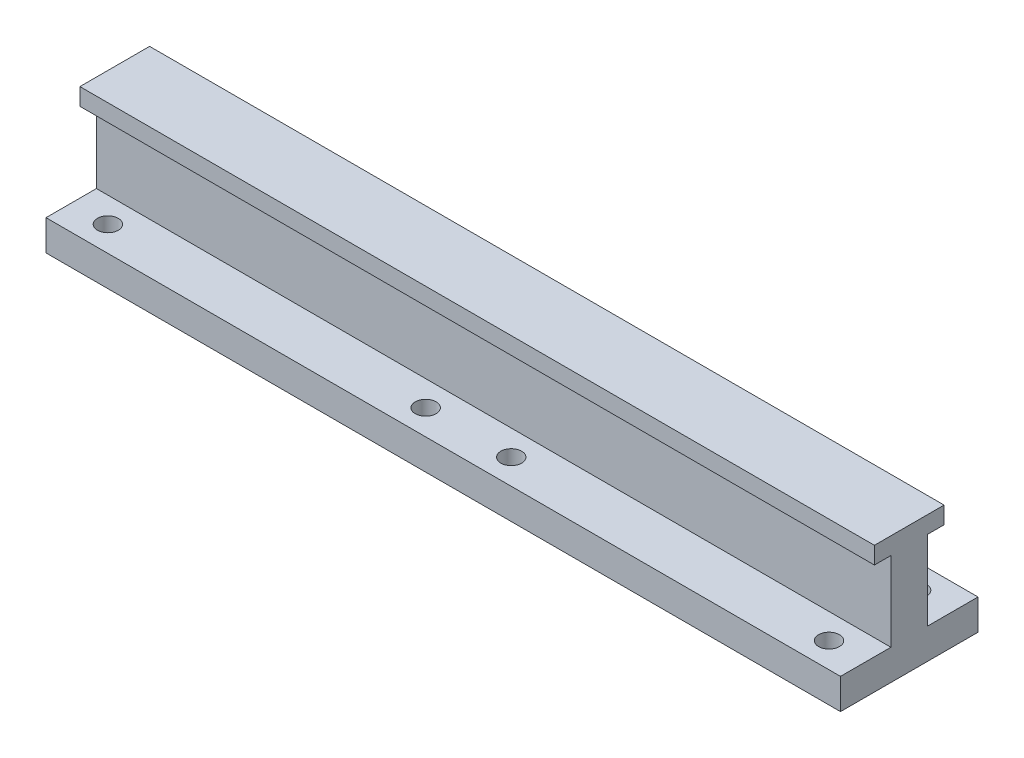
ISO-10303-21;
HEADER;
FILE_DESCRIPTION(('STEP AP214'),'2;1');
FILE_NAME('part.step','',(''),(''),'','','');
FILE_SCHEMA(('AUTOMOTIVE_DESIGN { 1 0 10303 214 1 1 1 1 }'));
ENDSEC;
DATA;
#1=APPLICATION_CONTEXT('core data for automotive mechanical design processes');
#2=APPLICATION_PROTOCOL_DEFINITION('international standard','automotive_design',2000,#1);
#3=PRODUCT_CONTEXT('',#1,'mechanical');
#4=PRODUCT('Part','Part','',(#3));
#5=PRODUCT_RELATED_PRODUCT_CATEGORY('part','',(#4));
#6=PRODUCT_DEFINITION_FORMATION('','',#4);
#7=PRODUCT_DEFINITION_CONTEXT('part definition',#1,'design');
#8=PRODUCT_DEFINITION('design','',#6,#7);
#9=PRODUCT_DEFINITION_SHAPE('','',#8);
#10=(LENGTH_UNIT() NAMED_UNIT(*) SI_UNIT(.MILLI.,.METRE.));
#11=(NAMED_UNIT(*) PLANE_ANGLE_UNIT() SI_UNIT($,.RADIAN.));
#12=(NAMED_UNIT(*) SI_UNIT($,.STERADIAN.) SOLID_ANGLE_UNIT());
#13=UNCERTAINTY_MEASURE_WITH_UNIT(LENGTH_MEASURE(1.E-05),#10,'distance_accuracy_value','');
#14=(GEOMETRIC_REPRESENTATION_CONTEXT(3) GLOBAL_UNCERTAINTY_ASSIGNED_CONTEXT((#13)) GLOBAL_UNIT_ASSIGNED_CONTEXT((#10,
#11,#12)) REPRESENTATION_CONTEXT('',''));
#15=CARTESIAN_POINT('',(0.,0.,0.));
#16=DIRECTION('',(0.,0.,1.));
#17=DIRECTION('',(1.,0.,0.));
#18=AXIS2_PLACEMENT_3D('',#15,#16,#17);
#19=CARTESIAN_POINT('',(0.,0.,22.5));
#20=DIRECTION('',(0.,1.,0.));
#21=DIRECTION('',(0.,0.,1.));
#22=AXIS2_PLACEMENT_3D('',#19,#20,#21);
#23=PLANE('',#22);
#24=CARTESIAN_POINT('',(58.,0.,18.375));
#25=DIRECTION('',(0.,1.,0.));
#26=DIRECTION('',(0.,0.,1.));
#27=AXIS2_PLACEMENT_3D('',#24,#25,#26);
#28=CIRCLE('',#27,1.7);
#29=CARTESIAN_POINT('',(58.,0.,20.075));
#30=VERTEX_POINT('',#29);
#31=EDGE_CURVE('E253',#30,#30,#28,.F.);
#32=ORIENTED_EDGE('',*,*,#31,.F.);
#33=EDGE_LOOP('',(#32));
#34=FACE_BOUND('',#33,.T.);
#35=CARTESIAN_POINT('',(72.,0.,18.375));
#36=DIRECTION('',(0.,1.,0.));
#37=DIRECTION('',(0.,0.,1.));
#38=AXIS2_PLACEMENT_3D('',#35,#36,#37);
#39=CIRCLE('',#38,1.7);
#40=CARTESIAN_POINT('',(72.,0.,20.075));
#41=VERTEX_POINT('',#40);
#42=EDGE_CURVE('E247',#41,#41,#39,.F.);
#43=ORIENTED_EDGE('',*,*,#42,.F.);
#44=EDGE_LOOP('',(#43));
#45=FACE_BOUND('',#44,.T.);
#46=CARTESIAN_POINT('',(124.,0.,18.375));
#47=DIRECTION('',(0.,1.,0.));
#48=DIRECTION('',(0.,0.,1.));
#49=AXIS2_PLACEMENT_3D('',#46,#47,#48);
#50=CIRCLE('',#49,1.70000000000001);
#51=CARTESIAN_POINT('',(124.,0.,20.075));
#52=VERTEX_POINT('',#51);
#53=EDGE_CURVE('E243',#52,#52,#50,.F.);
#54=ORIENTED_EDGE('',*,*,#53,.F.);
#55=EDGE_LOOP('',(#54));
#56=FACE_BOUND('',#55,.T.);
#57=CARTESIAN_POINT('',(6.,0.,18.375));
#58=DIRECTION('',(0.,1.,0.));
#59=DIRECTION('',(0.,0.,1.));
#60=AXIS2_PLACEMENT_3D('',#57,#58,#59);
#61=CIRCLE('',#60,1.7);
#62=CARTESIAN_POINT('',(6.,0.,20.075));
#63=VERTEX_POINT('',#62);
#64=EDGE_CURVE('E152',#63,#63,#61,.F.);
#65=ORIENTED_EDGE('',*,*,#64,.F.);
#66=EDGE_LOOP('',(#65));
#67=FACE_BOUND('',#66,.T.);
#68=DIRECTION('',(1.,0.,0.));
#69=VECTOR('',#68,1.);
#70=CARTESIAN_POINT('',(0.,0.,0.));
#71=LINE('',#70,#69);
#72=CARTESIAN_POINT('',(0.,0.,0.));
#73=VERTEX_POINT('',#72);
#74=CARTESIAN_POINT('',(130.,0.,0.));
#75=VERTEX_POINT('',#74);
#76=EDGE_CURVE('E179',#73,#75,#71,.T.);
#77=ORIENTED_EDGE('',*,*,#76,.T.);
#78=DIRECTION('',(0.,0.,-1.));
#79=VECTOR('',#78,1.);
#80=CARTESIAN_POINT('',(130.,0.,22.5));
#81=LINE('',#80,#79);
#82=CARTESIAN_POINT('',(130.,0.,22.5));
#83=VERTEX_POINT('',#82);
#84=EDGE_CURVE('E47',#83,#75,#81,.T.);
#85=ORIENTED_EDGE('',*,*,#84,.F.);
#86=DIRECTION('',(1.,0.,0.));
#87=VECTOR('',#86,1.);
#88=CARTESIAN_POINT('',(0.,0.,22.5));
#89=LINE('',#88,#87);
#90=CARTESIAN_POINT('',(0.,0.,22.5));
#91=VERTEX_POINT('',#90);
#92=EDGE_CURVE('E92',#91,#83,#89,.T.);
#93=ORIENTED_EDGE('',*,*,#92,.F.);
#94=DIRECTION('',(0.,0.,-1.));
#95=VECTOR('',#94,1.);
#96=CARTESIAN_POINT('',(0.,0.,22.5));
#97=LINE('',#96,#95);
#98=EDGE_CURVE('E11',#91,#73,#97,.T.);
#99=ORIENTED_EDGE('',*,*,#98,.T.);
#100=EDGE_LOOP('',(#77,#85,#93,#99));
#101=FACE_BOUND('',#100,.T.);
#102=CARTESIAN_POINT('',(6.,0.,4.12499999999999));
#103=DIRECTION('',(0.,1.,0.));
#104=DIRECTION('',(0.,0.,1.));
#105=AXIS2_PLACEMENT_3D('',#102,#103,#104);
#106=CIRCLE('',#105,1.7);
#107=CARTESIAN_POINT('',(6.,0.,5.82499999999999));
#108=VERTEX_POINT('',#107);
#109=EDGE_CURVE('E263',#108,#108,#106,.T.);
#110=ORIENTED_EDGE('',*,*,#109,.T.);
#111=EDGE_LOOP('',(#110));
#112=FACE_BOUND('',#111,.T.);
#113=CARTESIAN_POINT('',(58.,0.,4.125));
#114=DIRECTION('',(0.,1.,0.));
#115=DIRECTION('',(0.,0.,1.));
#116=AXIS2_PLACEMENT_3D('',#113,#114,#115);
#117=CIRCLE('',#116,1.7);
#118=CARTESIAN_POINT('',(58.,0.,5.825));
#119=VERTEX_POINT('',#118);
#120=EDGE_CURVE('E269',#119,#119,#117,.T.);
#121=ORIENTED_EDGE('',*,*,#120,.T.);
#122=EDGE_LOOP('',(#121));
#123=FACE_BOUND('',#122,.T.);
#124=CARTESIAN_POINT('',(72.,0.,4.125));
#125=DIRECTION('',(0.,1.,0.));
#126=DIRECTION('',(0.,0.,1.));
#127=AXIS2_PLACEMENT_3D('',#124,#125,#126);
#128=CIRCLE('',#127,1.7);
#129=CARTESIAN_POINT('',(72.,0.,5.825));
#130=VERTEX_POINT('',#129);
#131=EDGE_CURVE('E240',#130,#130,#128,.T.);
#132=ORIENTED_EDGE('',*,*,#131,.T.);
#133=EDGE_LOOP('',(#132));
#134=FACE_BOUND('',#133,.T.);
#135=CARTESIAN_POINT('',(124.,0.,4.125));
#136=DIRECTION('',(0.,1.,0.));
#137=DIRECTION('',(0.,0.,1.));
#138=AXIS2_PLACEMENT_3D('',#135,#136,#137);
#139=CIRCLE('',#138,1.70000000000001);
#140=CARTESIAN_POINT('',(124.,0.,5.82500000000002));
#141=VERTEX_POINT('',#140);
#142=EDGE_CURVE('E239',#141,#141,#139,.T.);
#143=ORIENTED_EDGE('',*,*,#142,.T.);
#144=EDGE_LOOP('',(#143));
#145=FACE_BOUND('',#144,.T.);
#146=ADVANCED_FACE('F39',(#34,#45,#56,#67,#101,#112,#123,#134,#145),#23,.F.);
#147=CARTESIAN_POINT('',(0.,5.,22.5));
#148=DIRECTION('',(0.,-1.,0.));
#149=DIRECTION('',(0.,0.,-1.));
#150=AXIS2_PLACEMENT_3D('',#147,#148,#149);
#151=PLANE('',#150);
#152=CARTESIAN_POINT('',(124.,5.,4.125));
#153=DIRECTION('',(0.,-1.,0.));
#154=DIRECTION('',(0.,0.,-1.));
#155=AXIS2_PLACEMENT_3D('',#152,#153,#154);
#156=CIRCLE('',#155,1.70000000000001);
#157=CARTESIAN_POINT('',(124.,5.,2.42499999999999));
#158=VERTEX_POINT('',#157);
#159=EDGE_CURVE('E236',#158,#158,#156,.T.);
#160=ORIENTED_EDGE('',*,*,#159,.T.);
#161=EDGE_LOOP('',(#160));
#162=FACE_BOUND('',#161,.T.);
#163=CARTESIAN_POINT('',(72.,5.,4.125));
#164=DIRECTION('',(0.,-1.,0.));
#165=DIRECTION('',(0.,0.,-1.));
#166=AXIS2_PLACEMENT_3D('',#163,#164,#165);
#167=CIRCLE('',#166,1.7);
#168=CARTESIAN_POINT('',(72.,5.,2.425));
#169=VERTEX_POINT('',#168);
#170=EDGE_CURVE('E272',#169,#169,#167,.T.);
#171=ORIENTED_EDGE('',*,*,#170,.T.);
#172=EDGE_LOOP('',(#171));
#173=FACE_BOUND('',#172,.T.);
#174=CARTESIAN_POINT('',(58.,5.,4.125));
#175=DIRECTION('',(0.,-1.,0.));
#176=DIRECTION('',(0.,0.,-1.));
#177=AXIS2_PLACEMENT_3D('',#174,#175,#176);
#178=CIRCLE('',#177,1.7);
#179=CARTESIAN_POINT('',(58.,5.,2.425));
#180=VERTEX_POINT('',#179);
#181=EDGE_CURVE('E266',#180,#180,#178,.T.);
#182=ORIENTED_EDGE('',*,*,#181,.T.);
#183=EDGE_LOOP('',(#182));
#184=FACE_BOUND('',#183,.T.);
#185=CARTESIAN_POINT('',(6.,5.,4.12499999999999));
#186=DIRECTION('',(0.,-1.,0.));
#187=DIRECTION('',(0.,0.,-1.));
#188=AXIS2_PLACEMENT_3D('',#185,#186,#187);
#189=CIRCLE('',#188,1.7);
#190=CARTESIAN_POINT('',(6.,5.,2.42499999999999));
#191=VERTEX_POINT('',#190);
#192=EDGE_CURVE('E260',#191,#191,#189,.T.);
#193=ORIENTED_EDGE('',*,*,#192,.T.);
#194=EDGE_LOOP('',(#193));
#195=FACE_BOUND('',#194,.T.);
#196=DIRECTION('',(-1.,0.,0.));
#197=VECTOR('',#196,1.);
#198=CARTESIAN_POINT('',(149.483326204732,5.,8.25));
#199=LINE('',#198,#197);
#200=CARTESIAN_POINT('',(130.,5.,8.25));
#201=VERTEX_POINT('',#200);
#202=CARTESIAN_POINT('',(0.,5.,8.25));
#203=VERTEX_POINT('',#202);
#204=EDGE_CURVE('E139',#201,#203,#199,.T.);
#205=ORIENTED_EDGE('',*,*,#204,.F.);
#206=DIRECTION('',(0.,0.,-1.));
#207=VECTOR('',#206,1.);
#208=CARTESIAN_POINT('',(130.,5.,22.5));
#209=LINE('',#208,#207);
#210=CARTESIAN_POINT('',(130.,5.,0.));
#211=VERTEX_POINT('',#210);
#212=EDGE_CURVE('E161',#201,#211,#209,.T.);
#213=ORIENTED_EDGE('',*,*,#212,.T.);
#214=DIRECTION('',(-1.,0.,0.));
#215=VECTOR('',#214,1.);
#216=CARTESIAN_POINT('',(0.,5.,0.));
#217=LINE('',#216,#215);
#218=CARTESIAN_POINT('',(0.,5.,0.));
#219=VERTEX_POINT('',#218);
#220=EDGE_CURVE('E156',#211,#219,#217,.T.);
#221=ORIENTED_EDGE('',*,*,#220,.T.);
#222=DIRECTION('',(0.,0.,-1.));
#223=VECTOR('',#222,1.);
#224=CARTESIAN_POINT('',(0.,5.,22.5));
#225=LINE('',#224,#223);
#226=EDGE_CURVE('E85',#203,#219,#225,.T.);
#227=ORIENTED_EDGE('',*,*,#226,.F.);
#228=EDGE_LOOP('',(#205,#213,#221,#227));
#229=FACE_BOUND('',#228,.T.);
#230=ADVANCED_FACE('F154',(#162,#173,#184,#195,#229),#151,.F.);
#231=CARTESIAN_POINT('',(0.,0.,22.5));
#232=DIRECTION('',(1.,0.,0.));
#233=DIRECTION('',(0.,0.,-1.));
#234=AXIS2_PLACEMENT_3D('',#231,#232,#233);
#235=PLANE('',#234);
#236=DIRECTION('',(0.,-1.,0.));
#237=VECTOR('',#236,1.);
#238=CARTESIAN_POINT('',(0.,0.,0.));
#239=LINE('',#238,#237);
#240=EDGE_CURVE('E181',#219,#73,#239,.T.);
#241=ORIENTED_EDGE('',*,*,#240,.T.);
#242=ORIENTED_EDGE('',*,*,#98,.F.);
#243=DIRECTION('',(0.,-1.,0.));
#244=VECTOR('',#243,1.);
#245=CARTESIAN_POINT('',(0.,0.,22.5));
#246=LINE('',#245,#244);
#247=CARTESIAN_POINT('',(0.,5.,22.5));
#248=VERTEX_POINT('',#247);
#249=EDGE_CURVE('E180',#248,#91,#246,.T.);
#250=ORIENTED_EDGE('',*,*,#249,.F.);
#251=CARTESIAN_POINT('',(0.,5.,14.25));
#252=VERTEX_POINT('',#251);
#253=EDGE_CURVE('E158',#248,#252,#225,.T.);
#254=ORIENTED_EDGE('',*,*,#253,.T.);
#255=DIRECTION('',(0.,1.,0.));
#256=VECTOR('',#255,1.);
#257=CARTESIAN_POINT('',(0.,0.,14.25));
#258=LINE('',#257,#256);
#259=CARTESIAN_POINT('',(0.,18.,14.25));
#260=VERTEX_POINT('',#259);
#261=EDGE_CURVE('E54',#252,#260,#258,.T.);
#262=ORIENTED_EDGE('',*,*,#261,.T.);
#263=DIRECTION('',(0.,0.,1.));
#264=VECTOR('',#263,1.);
#265=CARTESIAN_POINT('',(0.,18.,0.));
#266=LINE('',#265,#264);
#267=CARTESIAN_POINT('',(0.,18.,16.95));
#268=VERTEX_POINT('',#267);
#269=EDGE_CURVE('E212',#260,#268,#266,.T.);
#270=ORIENTED_EDGE('',*,*,#269,.T.);
#271=DIRECTION('',(0.,1.,0.));
#272=VECTOR('',#271,1.);
#273=CARTESIAN_POINT('',(0.,0.,16.95));
#274=LINE('',#273,#272);
#275=CARTESIAN_POINT('',(0.,20.8,16.95));
#276=VERTEX_POINT('',#275);
#277=EDGE_CURVE('E209',#268,#276,#274,.T.);
#278=ORIENTED_EDGE('',*,*,#277,.T.);
#279=DIRECTION('',(0.,0.,1.));
#280=VECTOR('',#279,1.);
#281=CARTESIAN_POINT('',(0.,20.8,0.));
#282=LINE('',#281,#280);
#283=CARTESIAN_POINT('',(0.,20.8,5.55));
#284=VERTEX_POINT('',#283);
#285=EDGE_CURVE('E206',#284,#276,#282,.T.);
#286=ORIENTED_EDGE('',*,*,#285,.F.);
#287=DIRECTION('',(0.,1.,0.));
#288=VECTOR('',#287,1.);
#289=CARTESIAN_POINT('',(0.,0.,5.55));
#290=LINE('',#289,#288);
#291=CARTESIAN_POINT('',(0.,18.,5.55));
#292=VERTEX_POINT('',#291);
#293=EDGE_CURVE('E203',#292,#284,#290,.T.);
#294=ORIENTED_EDGE('',*,*,#293,.F.);
#295=DIRECTION('',(0.,0.,1.));
#296=VECTOR('',#295,1.);
#297=CARTESIAN_POINT('',(0.,18.,0.));
#298=LINE('',#297,#296);
#299=CARTESIAN_POINT('',(0.,18.,8.24999999999999));
#300=VERTEX_POINT('',#299);
#301=EDGE_CURVE('E148',#292,#300,#298,.T.);
#302=ORIENTED_EDGE('',*,*,#301,.T.);
#303=DIRECTION('',(0.,1.,0.));
#304=VECTOR('',#303,1.);
#305=CARTESIAN_POINT('',(0.,0.,8.25000000000004));
#306=LINE('',#305,#304);
#307=EDGE_CURVE('E142',#203,#300,#306,.T.);
#308=ORIENTED_EDGE('',*,*,#307,.F.);
#309=ORIENTED_EDGE('',*,*,#226,.T.);
#310=EDGE_LOOP('',(#241,#242,#250,#254,#262,#270,#278,#286,#294,#302,#308,#309));
#311=FACE_BOUND('',#310,.T.);
#312=ADVANCED_FACE('F41',(#311),#235,.F.);
#313=CARTESIAN_POINT('',(130.,0.,22.5));
#314=DIRECTION('',(-1.,0.,0.));
#315=DIRECTION('',(0.,0.,1.));
#316=AXIS2_PLACEMENT_3D('',#313,#314,#315);
#317=PLANE('',#316);
#318=DIRECTION('',(0.,1.,0.));
#319=VECTOR('',#318,1.);
#320=CARTESIAN_POINT('',(130.,0.,0.));
#321=LINE('',#320,#319);
#322=EDGE_CURVE('E175',#75,#211,#321,.T.);
#323=ORIENTED_EDGE('',*,*,#322,.T.);
#324=ORIENTED_EDGE('',*,*,#212,.F.);
#325=DIRECTION('',(0.,-1.,0.));
#326=VECTOR('',#325,1.);
#327=CARTESIAN_POINT('',(130.,0.,8.25000000000004));
#328=LINE('',#327,#326);
#329=CARTESIAN_POINT('',(130.,18.,8.24999999999999));
#330=VERTEX_POINT('',#329);
#331=EDGE_CURVE('E144',#330,#201,#328,.T.);
#332=ORIENTED_EDGE('',*,*,#331,.F.);
#333=DIRECTION('',(0.,0.,-1.));
#334=VECTOR('',#333,1.);
#335=CARTESIAN_POINT('',(130.,18.,0.));
#336=LINE('',#335,#334);
#337=CARTESIAN_POINT('',(130.,18.,5.55));
#338=VERTEX_POINT('',#337);
#339=EDGE_CURVE('E217',#330,#338,#336,.T.);
#340=ORIENTED_EDGE('',*,*,#339,.T.);
#341=DIRECTION('',(0.,-1.,0.));
#342=VECTOR('',#341,1.);
#343=CARTESIAN_POINT('',(130.,0.,5.55));
#344=LINE('',#343,#342);
#345=CARTESIAN_POINT('',(130.,20.8,5.55));
#346=VERTEX_POINT('',#345);
#347=EDGE_CURVE('E219',#346,#338,#344,.T.);
#348=ORIENTED_EDGE('',*,*,#347,.F.);
#349=DIRECTION('',(0.,0.,-1.));
#350=VECTOR('',#349,1.);
#351=CARTESIAN_POINT('',(130.,20.8,0.));
#352=LINE('',#351,#350);
#353=CARTESIAN_POINT('',(130.,20.8,16.95));
#354=VERTEX_POINT('',#353);
#355=EDGE_CURVE('E222',#354,#346,#352,.T.);
#356=ORIENTED_EDGE('',*,*,#355,.F.);
#357=DIRECTION('',(0.,-1.,0.));
#358=VECTOR('',#357,1.);
#359=CARTESIAN_POINT('',(130.,0.,16.95));
#360=LINE('',#359,#358);
#361=CARTESIAN_POINT('',(130.,18.,16.95));
#362=VERTEX_POINT('',#361);
#363=EDGE_CURVE('E225',#354,#362,#360,.T.);
#364=ORIENTED_EDGE('',*,*,#363,.T.);
#365=DIRECTION('',(0.,0.,-1.));
#366=VECTOR('',#365,1.);
#367=CARTESIAN_POINT('',(130.,18.,0.));
#368=LINE('',#367,#366);
#369=CARTESIAN_POINT('',(130.,18.,14.25));
#370=VERTEX_POINT('',#369);
#371=EDGE_CURVE('E227',#362,#370,#368,.T.);
#372=ORIENTED_EDGE('',*,*,#371,.T.);
#373=DIRECTION('',(0.,-1.,0.));
#374=VECTOR('',#373,1.);
#375=CARTESIAN_POINT('',(130.,0.,14.25));
#376=LINE('',#375,#374);
#377=CARTESIAN_POINT('',(130.,5.,14.25));
#378=VERTEX_POINT('',#377);
#379=EDGE_CURVE('E201',#370,#378,#376,.T.);
#380=ORIENTED_EDGE('',*,*,#379,.T.);
#381=CARTESIAN_POINT('',(130.,5.,22.5));
#382=VERTEX_POINT('',#381);
#383=EDGE_CURVE('E167',#382,#378,#209,.T.);
#384=ORIENTED_EDGE('',*,*,#383,.F.);
#385=DIRECTION('',(0.,1.,0.));
#386=VECTOR('',#385,1.);
#387=CARTESIAN_POINT('',(130.,0.,22.5));
#388=LINE('',#387,#386);
#389=EDGE_CURVE('E162',#83,#382,#388,.T.);
#390=ORIENTED_EDGE('',*,*,#389,.F.);
#391=ORIENTED_EDGE('',*,*,#84,.T.);
#392=EDGE_LOOP('',(#323,#324,#332,#340,#348,#356,#364,#372,#380,#384,#390,#391));
#393=FACE_BOUND('',#392,.T.);
#394=ADVANCED_FACE('F174',(#393),#317,.F.);
#395=CARTESIAN_POINT('',(58.,5.,18.375));
#396=DIRECTION('',(0.,1.,0.));
#397=DIRECTION('',(0.,0.,1.));
#398=AXIS2_PLACEMENT_3D('',#395,#396,#397);
#399=CIRCLE('',#398,1.7);
#400=CARTESIAN_POINT('',(58.,5.,20.075));
#401=VERTEX_POINT('',#400);
#402=EDGE_CURVE('E235',#401,#401,#399,.T.);
#403=ORIENTED_EDGE('',*,*,#402,.F.);
#404=EDGE_LOOP('',(#403));
#405=FACE_BOUND('',#404,.T.);
#406=CARTESIAN_POINT('',(72.,5.,18.375));
#407=DIRECTION('',(0.,1.,0.));
#408=DIRECTION('',(0.,0.,1.));
#409=AXIS2_PLACEMENT_3D('',#406,#407,#408);
#410=CIRCLE('',#409,1.7);
#411=CARTESIAN_POINT('',(72.,5.,20.075));
#412=VERTEX_POINT('',#411);
#413=EDGE_CURVE('E250',#412,#412,#410,.T.);
#414=ORIENTED_EDGE('',*,*,#413,.F.);
#415=EDGE_LOOP('',(#414));
#416=FACE_BOUND('',#415,.T.);
#417=CARTESIAN_POINT('',(124.,5.,18.375));
#418=DIRECTION('',(0.,1.,0.));
#419=DIRECTION('',(0.,0.,1.));
#420=AXIS2_PLACEMENT_3D('',#417,#418,#419);
#421=CIRCLE('',#420,1.70000000000001);
#422=CARTESIAN_POINT('',(124.,5.,20.075));
#423=VERTEX_POINT('',#422);
#424=EDGE_CURVE('E244',#423,#423,#421,.T.);
#425=ORIENTED_EDGE('',*,*,#424,.F.);
#426=EDGE_LOOP('',(#425));
#427=FACE_BOUND('',#426,.T.);
#428=CARTESIAN_POINT('',(6.,5.,18.375));
#429=DIRECTION('',(0.,1.,0.));
#430=DIRECTION('',(0.,0.,1.));
#431=AXIS2_PLACEMENT_3D('',#428,#429,#430);
#432=CIRCLE('',#431,1.7);
#433=CARTESIAN_POINT('',(6.,5.,20.075));
#434=VERTEX_POINT('',#433);
#435=EDGE_CURVE('E232',#434,#434,#432,.T.);
#436=ORIENTED_EDGE('',*,*,#435,.F.);
#437=EDGE_LOOP('',(#436));
#438=FACE_BOUND('',#437,.T.);
#439=ORIENTED_EDGE('',*,*,#383,.T.);
#440=DIRECTION('',(-1.,0.,0.));
#441=VECTOR('',#440,1.);
#442=CARTESIAN_POINT('',(149.483326204732,5.,14.25));
#443=LINE('',#442,#441);
#444=EDGE_CURVE('E147',#378,#252,#443,.T.);
#445=ORIENTED_EDGE('',*,*,#444,.T.);
#446=ORIENTED_EDGE('',*,*,#253,.F.);
#447=DIRECTION('',(-1.,0.,0.));
#448=VECTOR('',#447,1.);
#449=CARTESIAN_POINT('',(0.,5.,22.5));
#450=LINE('',#449,#448);
#451=EDGE_CURVE('E63',#382,#248,#450,.T.);
#452=ORIENTED_EDGE('',*,*,#451,.F.);
#453=EDGE_LOOP('',(#439,#445,#446,#452));
#454=FACE_BOUND('',#453,.T.);
#455=ADVANCED_FACE('F303',(#405,#416,#427,#438,#454),#151,.F.);
#456=CARTESIAN_POINT('',(0.,0.,22.5));
#457=DIRECTION('',(0.,0.,-1.));
#458=DIRECTION('',(-1.,0.,0.));
#459=AXIS2_PLACEMENT_3D('',#456,#457,#458);
#460=PLANE('',#459);
#461=ORIENTED_EDGE('',*,*,#249,.T.);
#462=ORIENTED_EDGE('',*,*,#92,.T.);
#463=ORIENTED_EDGE('',*,*,#389,.T.);
#464=ORIENTED_EDGE('',*,*,#451,.T.);
#465=EDGE_LOOP('',(#461,#462,#463,#464));
#466=FACE_BOUND('',#465,.T.);
#467=ADVANCED_FACE('F310',(#466),#460,.F.);
#468=CARTESIAN_POINT('',(0.,0.,0.));
#469=DIRECTION('',(0.,0.,-1.));
#470=DIRECTION('',(-1.,0.,0.));
#471=AXIS2_PLACEMENT_3D('',#468,#469,#470);
#472=PLANE('',#471);
#473=ORIENTED_EDGE('',*,*,#240,.F.);
#474=ORIENTED_EDGE('',*,*,#220,.F.);
#475=ORIENTED_EDGE('',*,*,#322,.F.);
#476=ORIENTED_EDGE('',*,*,#76,.F.);
#477=EDGE_LOOP('',(#473,#474,#475,#476));
#478=FACE_BOUND('',#477,.T.);
#479=ADVANCED_FACE('F178',(#478),#472,.T.);
#480=CARTESIAN_POINT('',(149.483326204732,0.,14.25));
#481=DIRECTION('',(0.,0.,1.));
#482=DIRECTION('',(0.,-1.,0.));
#483=AXIS2_PLACEMENT_3D('',#480,#481,#482);
#484=PLANE('',#483);
#485=ORIENTED_EDGE('',*,*,#379,.F.);
#486=DIRECTION('',(-1.,0.,0.));
#487=VECTOR('',#486,1.);
#488=CARTESIAN_POINT('',(149.483326204732,18.,14.25));
#489=LINE('',#488,#487);
#490=EDGE_CURVE('E189',#370,#260,#489,.T.);
#491=ORIENTED_EDGE('',*,*,#490,.T.);
#492=ORIENTED_EDGE('',*,*,#261,.F.);
#493=ORIENTED_EDGE('',*,*,#444,.F.);
#494=EDGE_LOOP('',(#485,#491,#492,#493));
#495=FACE_BOUND('',#494,.T.);
#496=ADVANCED_FACE('F314',(#495),#484,.T.);
#497=CARTESIAN_POINT('',(149.483326204732,18.,0.));
#498=DIRECTION('',(0.,-1.,0.));
#499=DIRECTION('',(0.,0.,-1.));
#500=AXIS2_PLACEMENT_3D('',#497,#498,#499);
#501=PLANE('',#500);
#502=ORIENTED_EDGE('',*,*,#371,.F.);
#503=DIRECTION('',(-1.,0.,0.));
#504=VECTOR('',#503,1.);
#505=CARTESIAN_POINT('',(149.483326204732,18.,16.95));
#506=LINE('',#505,#504);
#507=EDGE_CURVE('E191',#362,#268,#506,.T.);
#508=ORIENTED_EDGE('',*,*,#507,.T.);
#509=ORIENTED_EDGE('',*,*,#269,.F.);
#510=ORIENTED_EDGE('',*,*,#490,.F.);
#511=EDGE_LOOP('',(#502,#508,#509,#510));
#512=FACE_BOUND('',#511,.T.);
#513=ADVANCED_FACE('F323',(#512),#501,.T.);
#514=CARTESIAN_POINT('',(149.483326204732,0.,16.95));
#515=DIRECTION('',(0.,0.,1.));
#516=DIRECTION('',(1.,0.,0.));
#517=AXIS2_PLACEMENT_3D('',#514,#515,#516);
#518=PLANE('',#517);
#519=ORIENTED_EDGE('',*,*,#363,.F.);
#520=DIRECTION('',(-1.,0.,0.));
#521=VECTOR('',#520,1.);
#522=CARTESIAN_POINT('',(149.483326204732,20.8,16.95));
#523=LINE('',#522,#521);
#524=EDGE_CURVE('E193',#354,#276,#523,.T.);
#525=ORIENTED_EDGE('',*,*,#524,.T.);
#526=ORIENTED_EDGE('',*,*,#277,.F.);
#527=ORIENTED_EDGE('',*,*,#507,.F.);
#528=EDGE_LOOP('',(#519,#525,#526,#527));
#529=FACE_BOUND('',#528,.T.);
#530=ADVANCED_FACE('F326',(#529),#518,.T.);
#531=CARTESIAN_POINT('',(149.483326204732,20.8,0.));
#532=DIRECTION('',(0.,-1.,0.));
#533=DIRECTION('',(0.,0.,-1.));
#534=AXIS2_PLACEMENT_3D('',#531,#532,#533);
#535=PLANE('',#534);
#536=ORIENTED_EDGE('',*,*,#524,.F.);
#537=ORIENTED_EDGE('',*,*,#355,.T.);
#538=DIRECTION('',(-1.,0.,0.));
#539=VECTOR('',#538,1.);
#540=CARTESIAN_POINT('',(149.483326204732,20.8,5.55));
#541=LINE('',#540,#539);
#542=EDGE_CURVE('E195',#346,#284,#541,.T.);
#543=ORIENTED_EDGE('',*,*,#542,.T.);
#544=ORIENTED_EDGE('',*,*,#285,.T.);
#545=EDGE_LOOP('',(#536,#537,#543,#544));
#546=FACE_BOUND('',#545,.T.);
#547=ADVANCED_FACE('F330',(#546),#535,.F.);
#548=CARTESIAN_POINT('',(149.483326204732,0.,5.55));
#549=DIRECTION('',(0.,0.,1.));
#550=DIRECTION('',(1.,0.,0.));
#551=AXIS2_PLACEMENT_3D('',#548,#549,#550);
#552=PLANE('',#551);
#553=ORIENTED_EDGE('',*,*,#542,.F.);
#554=ORIENTED_EDGE('',*,*,#347,.T.);
#555=DIRECTION('',(-1.,0.,0.));
#556=VECTOR('',#555,1.);
#557=CARTESIAN_POINT('',(149.483326204732,18.,5.55));
#558=LINE('',#557,#556);
#559=EDGE_CURVE('E197',#338,#292,#558,.T.);
#560=ORIENTED_EDGE('',*,*,#559,.T.);
#561=ORIENTED_EDGE('',*,*,#293,.T.);
#562=EDGE_LOOP('',(#553,#554,#560,#561));
#563=FACE_BOUND('',#562,.T.);
#564=ADVANCED_FACE('F334',(#563),#552,.F.);
#565=CARTESIAN_POINT('',(149.483326204732,18.,0.));
#566=DIRECTION('',(0.,-1.,0.));
#567=DIRECTION('',(0.,0.,-1.));
#568=AXIS2_PLACEMENT_3D('',#565,#566,#567);
#569=PLANE('',#568);
#570=ORIENTED_EDGE('',*,*,#339,.F.);
#571=DIRECTION('',(-1.,0.,0.));
#572=VECTOR('',#571,1.);
#573=CARTESIAN_POINT('',(149.483326204732,18.,8.24999999999999));
#574=LINE('',#573,#572);
#575=EDGE_CURVE('E199',#330,#300,#574,.T.);
#576=ORIENTED_EDGE('',*,*,#575,.T.);
#577=ORIENTED_EDGE('',*,*,#301,.F.);
#578=ORIENTED_EDGE('',*,*,#559,.F.);
#579=EDGE_LOOP('',(#570,#576,#577,#578));
#580=FACE_BOUND('',#579,.T.);
#581=ADVANCED_FACE('F320',(#580),#569,.T.);
#582=CARTESIAN_POINT('',(149.483326204732,0.,8.25000000000004));
#583=DIRECTION('',(0.,0.,1.));
#584=DIRECTION('',(0.,-1.,0.));
#585=AXIS2_PLACEMENT_3D('',#582,#583,#584);
#586=PLANE('',#585);
#587=ORIENTED_EDGE('',*,*,#575,.F.);
#588=ORIENTED_EDGE('',*,*,#331,.T.);
#589=ORIENTED_EDGE('',*,*,#204,.T.);
#590=ORIENTED_EDGE('',*,*,#307,.T.);
#591=EDGE_LOOP('',(#587,#588,#589,#590));
#592=FACE_BOUND('',#591,.T.);
#593=ADVANCED_FACE('F141',(#592),#586,.F.);
#594=CARTESIAN_POINT('',(6.,-0.00100000000000013,18.375));
#595=DIRECTION('',(0.,1.,0.));
#596=DIRECTION('',(0.,0.,1.));
#597=AXIS2_PLACEMENT_3D('',#594,#595,#596);
#598=CYLINDRICAL_SURFACE('',#597,1.7);
#599=ORIENTED_EDGE('',*,*,#435,.T.);
#600=EDGE_LOOP('',(#599));
#601=FACE_BOUND('',#600,.T.);
#602=ORIENTED_EDGE('',*,*,#64,.T.);
#603=EDGE_LOOP('',(#602));
#604=FACE_BOUND('',#603,.T.);
#605=ADVANCED_FACE('F319',(#601,#604),#598,.F.);
#606=CARTESIAN_POINT('',(124.,-0.00100000000000013,18.375));
#607=DIRECTION('',(0.,1.,0.));
#608=DIRECTION('',(0.,0.,1.));
#609=AXIS2_PLACEMENT_3D('',#606,#607,#608);
#610=CYLINDRICAL_SURFACE('',#609,1.70000000000001);
#611=ORIENTED_EDGE('',*,*,#424,.T.);
#612=EDGE_LOOP('',(#611));
#613=FACE_BOUND('',#612,.T.);
#614=ORIENTED_EDGE('',*,*,#53,.T.);
#615=EDGE_LOOP('',(#614));
#616=FACE_BOUND('',#615,.T.);
#617=ADVANCED_FACE('F343',(#613,#616),#610,.F.);
#618=CARTESIAN_POINT('',(72.,-0.00100000000000013,18.375));
#619=DIRECTION('',(0.,1.,0.));
#620=DIRECTION('',(0.,0.,1.));
#621=AXIS2_PLACEMENT_3D('',#618,#619,#620);
#622=CYLINDRICAL_SURFACE('',#621,1.7);
#623=ORIENTED_EDGE('',*,*,#413,.T.);
#624=EDGE_LOOP('',(#623));
#625=FACE_BOUND('',#624,.T.);
#626=ORIENTED_EDGE('',*,*,#42,.T.);
#627=EDGE_LOOP('',(#626));
#628=FACE_BOUND('',#627,.T.);
#629=ADVANCED_FACE('F348',(#625,#628),#622,.F.);
#630=CARTESIAN_POINT('',(58.,-0.00100000000000013,18.375));
#631=DIRECTION('',(0.,1.,0.));
#632=DIRECTION('',(0.,0.,1.));
#633=AXIS2_PLACEMENT_3D('',#630,#631,#632);
#634=CYLINDRICAL_SURFACE('',#633,1.7);
#635=ORIENTED_EDGE('',*,*,#402,.T.);
#636=EDGE_LOOP('',(#635));
#637=FACE_BOUND('',#636,.T.);
#638=ORIENTED_EDGE('',*,*,#31,.T.);
#639=EDGE_LOOP('',(#638));
#640=FACE_BOUND('',#639,.T.);
#641=ADVANCED_FACE('F352',(#637,#640),#634,.F.);
#642=CARTESIAN_POINT('',(6.,-0.00100000000000013,4.12499999999999));
#643=DIRECTION('',(0.,1.,0.));
#644=DIRECTION('',(0.,0.,1.));
#645=AXIS2_PLACEMENT_3D('',#642,#643,#644);
#646=CYLINDRICAL_SURFACE('',#645,1.7);
#647=ORIENTED_EDGE('',*,*,#192,.F.);
#648=EDGE_LOOP('',(#647));
#649=FACE_BOUND('',#648,.T.);
#650=ORIENTED_EDGE('',*,*,#109,.F.);
#651=EDGE_LOOP('',(#650));
#652=FACE_BOUND('',#651,.T.);
#653=ADVANCED_FACE('F292',(#649,#652),#646,.F.);
#654=CARTESIAN_POINT('',(58.,-0.00100000000000013,4.125));
#655=DIRECTION('',(0.,1.,0.));
#656=DIRECTION('',(0.,0.,1.));
#657=AXIS2_PLACEMENT_3D('',#654,#655,#656);
#658=CYLINDRICAL_SURFACE('',#657,1.7);
#659=ORIENTED_EDGE('',*,*,#181,.F.);
#660=EDGE_LOOP('',(#659));
#661=FACE_BOUND('',#660,.T.);
#662=ORIENTED_EDGE('',*,*,#120,.F.);
#663=EDGE_LOOP('',(#662));
#664=FACE_BOUND('',#663,.T.);
#665=ADVANCED_FACE('F283',(#661,#664),#658,.F.);
#666=CARTESIAN_POINT('',(72.,-0.00100000000000013,4.125));
#667=DIRECTION('',(0.,1.,0.));
#668=DIRECTION('',(0.,0.,1.));
#669=AXIS2_PLACEMENT_3D('',#666,#667,#668);
#670=CYLINDRICAL_SURFACE('',#669,1.7);
#671=ORIENTED_EDGE('',*,*,#170,.F.);
#672=EDGE_LOOP('',(#671));
#673=FACE_BOUND('',#672,.T.);
#674=ORIENTED_EDGE('',*,*,#131,.F.);
#675=EDGE_LOOP('',(#674));
#676=FACE_BOUND('',#675,.T.);
#677=ADVANCED_FACE('F280',(#673,#676),#670,.F.);
#678=CARTESIAN_POINT('',(124.,-0.00100000000000013,4.125));
#679=DIRECTION('',(0.,1.,0.));
#680=DIRECTION('',(0.,0.,1.));
#681=AXIS2_PLACEMENT_3D('',#678,#679,#680);
#682=CYLINDRICAL_SURFACE('',#681,1.70000000000001);
#683=ORIENTED_EDGE('',*,*,#159,.F.);
#684=EDGE_LOOP('',(#683));
#685=FACE_BOUND('',#684,.T.);
#686=ORIENTED_EDGE('',*,*,#142,.F.);
#687=EDGE_LOOP('',(#686));
#688=FACE_BOUND('',#687,.T.);
#689=ADVANCED_FACE('F282',(#685,#688),#682,.F.);
#690=CLOSED_SHELL('',(#146,#230,#312,#394,#455,#467,#479,#496,#513,#530,#547,#564,#581,#593,
#605,#617,#629,#641,#653,#665,#677,#689));
#691=MANIFOLD_SOLID_BREP('B2',#690);
#692=ADVANCED_BREP_SHAPE_REPRESENTATION('',(#18,#691),#14);
#693=SHAPE_DEFINITION_REPRESENTATION(#9,#692);
ENDSEC;
END-ISO-10303-21;
